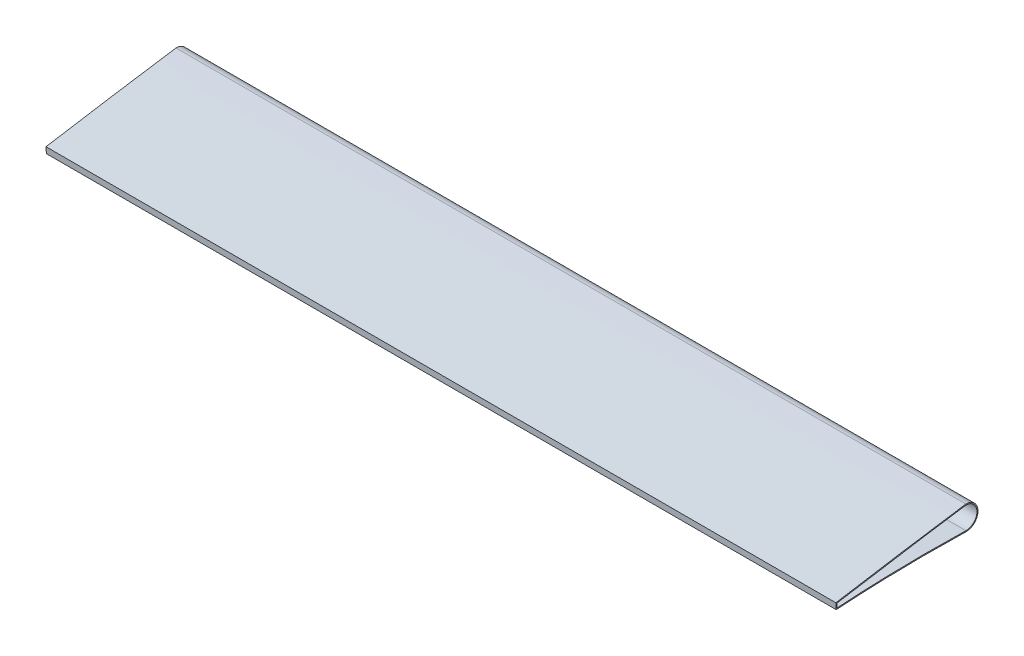
ISO-10303-21;
HEADER;
FILE_DESCRIPTION(('STEP AP214'),'2;1');
FILE_NAME('part.step','',(''),(''),'','','');
FILE_SCHEMA(('AUTOMOTIVE_DESIGN { 1 0 10303 214 1 1 1 1 }'));
ENDSEC;
DATA;
#1=APPLICATION_CONTEXT('core data for automotive mechanical design processes');
#2=APPLICATION_PROTOCOL_DEFINITION('international standard','automotive_design',2000,#1);
#3=PRODUCT_CONTEXT('',#1,'mechanical');
#4=PRODUCT('Part','Part','',(#3));
#5=PRODUCT_RELATED_PRODUCT_CATEGORY('part','',(#4));
#6=PRODUCT_DEFINITION_FORMATION('','',#4);
#7=PRODUCT_DEFINITION_CONTEXT('part definition',#1,'design');
#8=PRODUCT_DEFINITION('design','',#6,#7);
#9=PRODUCT_DEFINITION_SHAPE('','',#8);
#10=(LENGTH_UNIT() NAMED_UNIT(*) SI_UNIT(.MILLI.,.METRE.));
#11=(NAMED_UNIT(*) PLANE_ANGLE_UNIT() SI_UNIT($,.RADIAN.));
#12=(NAMED_UNIT(*) SI_UNIT($,.STERADIAN.) SOLID_ANGLE_UNIT());
#13=UNCERTAINTY_MEASURE_WITH_UNIT(LENGTH_MEASURE(1.E-05),#10,'distance_accuracy_value','');
#14=(GEOMETRIC_REPRESENTATION_CONTEXT(3) GLOBAL_UNCERTAINTY_ASSIGNED_CONTEXT((#13)) GLOBAL_UNIT_ASSIGNED_CONTEXT((#10,
#11,#12)) REPRESENTATION_CONTEXT('',''));
#15=CARTESIAN_POINT('',(0.,0.,0.));
#16=DIRECTION('',(0.,0.,1.));
#17=DIRECTION('',(1.,0.,0.));
#18=AXIS2_PLACEMENT_3D('',#15,#16,#17);
#19=CARTESIAN_POINT('',(-245.,1.54811807563614,218.484170893473));
#20=DIRECTION('',(-1.,0.,0.));
#21=DIRECTION('',(0.,0.,1.));
#22=AXIS2_PLACEMENT_3D('',#19,#20,#21);
#23=PLANE('',#22);
#24=CARTESIAN_POINT('',(-245.,1.47565816003931,200.003953165107));
#25=CARTESIAN_POINT('',(-245.,1.5550062381094,203.082868041281));
#26=CARTESIAN_POINT('',(-245.,1.65294043801315,209.239827336821));
#27=CARTESIAN_POINT('',(-245.,1.58432130369397,218.492401608303));
#28=CARTESIAN_POINT('',(-245.,1.34612255147214,226.16172659372));
#29=CARTESIAN_POINT('',(-245.,1.03963471401543,232.348041607291));
#30=CARTESIAN_POINT('',(-245.,0.850980742380833,235.412171702867));
#31=CARTESIAN_POINT('',(-245.,0.750945052306502,236.947227100444));
#32=B_SPLINE_CURVE_WITH_KNOTS('',3,(#24,#25,#26,#27,#28,#29,#30,#31),.UNSPECIFIED.,.F.,.F.,(4,1,
1,1,1,4),(0.900150223832694,0.918378482775061,0.936606741717428,0.954835000659795,
0.963949130130978,0.973063259602162),.UNSPECIFIED.);
#33=CARTESIAN_POINT('',(-245.,1.4756581600393,200.003953165107));
#34=VERTEX_POINT('',#33);
#35=CARTESIAN_POINT('',(-245.,0.750945052306502,236.947227100444));
#36=VERTEX_POINT('',#35);
#37=EDGE_CURVE('E162',#34,#36,#32,.T.);
#38=ORIENTED_EDGE('',*,*,#37,.T.);
#39=DIRECTION('',(0.,0.998451108459366,0.0556361754280817));
#40=VECTOR('',#39,1.);
#41=CARTESIAN_POINT('',(-245.,0.750945052306502,236.947227100444));
#42=LINE('',#41,#40);
#43=CARTESIAN_POINT('',(-245.,2.51874319409193,237.045733203251));
#44=VERTEX_POINT('',#43);
#45=EDGE_CURVE('E168',#36,#44,#42,.T.);
#46=ORIENTED_EDGE('',*,*,#45,.T.);
#47=CARTESIAN_POINT('',(-245.,2.51874319409193,237.045733203251));
#48=CARTESIAN_POINT('',(-245.,3.04586863369897,233.96235181676));
#49=CARTESIAN_POINT('',(-245.,3.78856871338308,229.318057473885));
#50=CARTESIAN_POINT('',(-245.,4.74545641484109,223.164972389579));
#51=CARTESIAN_POINT('',(-245.,5.78379225791457,217.006036982189));
#52=CARTESIAN_POINT('',(-245.,6.99444308437882,209.288425537747));
#53=CARTESIAN_POINT('',(-245.,7.9078668041143,203.112011401083));
#54=CARTESIAN_POINT('',(-245.,8.35923310204181,200.022291431742));
#55=B_SPLINE_CURVE_WITH_KNOTS('',3,(#47,#48,#49,#50,#51,#52,#53,#54),.UNSPECIFIED.,.F.,.F.,(4,1,
1,1,1,4),(1.024875484438,1.04333956239571,1.05257160137456,1.06180364035342,1.08026771831113,
1.09873179626884),.UNSPECIFIED.);
#56=CARTESIAN_POINT('',(-245.,8.35923310204181,200.022291431742));
#57=VERTEX_POINT('',#56);
#58=EDGE_CURVE('E174',#44,#57,#55,.T.);
#59=ORIENTED_EDGE('',*,*,#58,.T.);
#60=CARTESIAN_POINT('',(-245.,4.91748058964992,200.));
#61=DIRECTION('',(-1.,0.,0.));
#62=DIRECTION('',(0.,0.,1.));
#63=AXIS2_PLACEMENT_3D('',#60,#61,#62);
#64=CIRCLE('',#63,3.44182469984819);
#65=EDGE_CURVE('E179',#57,#34,#64,.T.);
#66=ORIENTED_EDGE('',*,*,#65,.T.);
#67=EDGE_LOOP('',(#38,#46,#59,#66));
#68=FACE_BOUND('',#67,.T.);
#69=DIRECTION('',(0.,0.998451108459367,0.0556361754280593));
#70=VECTOR('',#69,1.);
#71=CARTESIAN_POINT('',(-245.,1.07000337478338,236.664540434259));
#72=LINE('',#71,#70);
#73=CARTESIAN_POINT('',(-245.,1.07000337478338,236.664540434259));
#74=VERTEX_POINT('',#73);
#75=CARTESIAN_POINT('',(-245.,2.26814470502278,236.731303844778));
#76=VERTEX_POINT('',#75);
#77=EDGE_CURVE('E108',#74,#76,#72,.T.);
#78=ORIENTED_EDGE('',*,*,#77,.F.);
#79=CARTESIAN_POINT('',(-245.,1.77565588982335,200.));
#80=CARTESIAN_POINT('',(-245.,1.80193007716887,201.019221484981));
#81=CARTESIAN_POINT('',(-245.,1.82483857387848,202.038532259108));
#82=CARTESIAN_POINT('',(-245.,1.86358383502489,204.076997742996));
#83=CARTESIAN_POINT('',(-245.,1.87942260932456,205.096152414666));
#84=CARTESIAN_POINT('',(-245.,1.90370051567506,207.134308539318));
#85=CARTESIAN_POINT('',(-245.,1.91214140703693,208.153309971078));
#86=CARTESIAN_POINT('',(-245.,1.92128464988394,210.191160710905));
#87=CARTESIAN_POINT('',(-245.,1.92198842628703,211.210010012427));
#88=CARTESIAN_POINT('',(-245.,1.91537925536241,213.247556441768));
#89=CARTESIAN_POINT('',(-245.,1.90806730305986,214.26625357278));
#90=CARTESIAN_POINT('',(-245.,1.88547227464753,216.303495388701));
#91=CARTESIAN_POINT('',(-245.,1.87018969851098,217.322040079165));
#92=CARTESIAN_POINT('',(-245.,1.83164752288026,219.358991314676));
#93=CARTESIAN_POINT('',(-245.,1.80838782316651,220.377397857827));
#94=CARTESIAN_POINT('',(-245.,1.75388238657816,222.414055884294));
#95=CARTESIAN_POINT('',(-245.,1.72263619238608,223.432307355388));
#96=CARTESIAN_POINT('',(-245.,1.65199617014503,225.4686487178));
#97=CARTESIAN_POINT('',(-245.,1.61260137607331,226.486738575624));
#98=CARTESIAN_POINT('',(-245.,1.52552785943149,228.522752051414));
#99=CARTESIAN_POINT('',(-245.,1.47784762258254,229.540675604888));
#100=CARTESIAN_POINT('',(-245.,1.4001478009914,231.067368719544));
#101=CARTESIAN_POINT('',(-245.,1.37321423596705,231.576297320398));
#102=CARTESIAN_POINT('',(-245.,1.31744402530208,232.594050824192));
#103=CARTESIAN_POINT('',(-245.,1.28860737799694,233.102875727041));
#104=CARTESIAN_POINT('',(-245.,1.22912827879368,234.120569378009));
#105=CARTESIAN_POINT('',(-245.,1.19848530015638,234.629438095277));
#106=CARTESIAN_POINT('',(-245.,1.1354970892692,235.647068904937));
#107=CARTESIAN_POINT('',(-245.,1.10315186139889,236.155830997602));
#108=CARTESIAN_POINT('',(-245.,1.07000337478338,236.664540434259));
#109=B_SPLINE_CURVE_WITH_KNOTS('',3,(#79,#80,#81,#82,#83,#84,#85,#86,#87,#88,#89,#90,#91,#92,
#93,#94,#95,#96,#97,#98,#99,#100,#101,#102,#103,#104,#105,#106,#107,#108),.UNSPECIFIED.,.F.,.F.,
(4,2,2,2,2,2,2,2,2,2,2,2,2,2,4),(0.,3.05867843013735,6.11648674890835,9.17356768433635,
12.2300855982153,15.2862241369955,18.3421709964681,21.3981562503518,24.4543165333021,
27.5108393342584,30.5679213455393,32.0968405884251,33.6257611685829,35.1551298199108,
36.6844945366367),.UNSPECIFIED.);
#110=CARTESIAN_POINT('',(-245.,1.77565588982335,200.));
#111=VERTEX_POINT('',#110);
#112=EDGE_CURVE('E127',#111,#74,#109,.T.);
#113=ORIENTED_EDGE('',*,*,#112,.F.);
#114=CARTESIAN_POINT('',(-245.,4.91748058964992,200.));
#115=DIRECTION('',(-1.,0.,0.));
#116=DIRECTION('',(0.,0.,1.));
#117=AXIS2_PLACEMENT_3D('',#114,#115,#116);
#118=CIRCLE('',#117,3.14182469984818);
#119=CARTESIAN_POINT('',(-245.,8.0593052894981,200.));
#120=VERTEX_POINT('',#119);
#121=EDGE_CURVE('E125',#120,#111,#118,.T.);
#122=ORIENTED_EDGE('',*,*,#121,.F.);
#123=CARTESIAN_POINT('',(-245.,2.26814470502278,236.731303844778));
#124=CARTESIAN_POINT('',(-245.,2.33083056445869,236.364621328988));
#125=CARTESIAN_POINT('',(-245.,2.39325546410141,235.997893955187));
#126=CARTESIAN_POINT('',(-245.,2.51745943686344,235.264336572296));
#127=CARTESIAN_POINT('',(-245.,2.579238521393,234.897506565138));
#128=CARTESIAN_POINT('',(-245.,2.70202855962353,234.16372175285));
#129=CARTESIAN_POINT('',(-245.,2.76303952113619,233.796766949029));
#130=CARTESIAN_POINT('',(-245.,2.88418324501267,233.062703808016));
#131=CARTESIAN_POINT('',(-245.,2.94431598763467,232.695595467563));
#132=CARTESIAN_POINT('',(-245.,3.06352746915682,231.961206970734));
#133=CARTESIAN_POINT('',(-245.,3.12260620621509,231.593926814059));
#134=CARTESIAN_POINT('',(-245.,3.23981871751814,230.859213897666));
#135=CARTESIAN_POINT('',(-245.,3.29795248656066,230.491781137121));
#136=CARTESIAN_POINT('',(-245.,3.44252043662053,229.573085609124));
#137=CARTESIAN_POINT('',(-245.,3.52857191345396,229.021762753734));
#138=CARTESIAN_POINT('',(-245.,3.70028746568279,227.919055978052));
#139=CARTESIAN_POINT('',(-245.,3.78595154031523,227.36767205764));
#140=CARTESIAN_POINT('',(-245.,3.95792020952995,226.265006783856));
#141=CARTESIAN_POINT('',(-245.,4.04422480041138,225.713725429909));
#142=CARTESIAN_POINT('',(-245.,4.17491380471411,224.886999756387));
#143=CARTESIAN_POINT('',(-245.,4.2186820109389,224.611458177864));
#144=CARTESIAN_POINT('',(-245.,4.30677577184764,224.060464142334));
#145=CARTESIAN_POINT('',(-245.,4.35110132644824,223.785011685314));
#146=CARTESIAN_POINT('',(-245.,4.44024658627286,223.234187830318));
#147=CARTESIAN_POINT('',(-245.,4.4850662897309,222.958816432055));
#148=CARTESIAN_POINT('',(-245.,4.57508113375219,222.408134967495));
#149=CARTESIAN_POINT('',(-245.,4.62027627442476,222.132824901216));
#150=CARTESIAN_POINT('',(-245.,4.75626859065517,221.306957330376));
#151=CARTESIAN_POINT('',(-245.,4.8474719530371,220.756466803068));
#152=CARTESIAN_POINT('',(-245.,5.03010415130944,219.655521062394));
#153=CARTESIAN_POINT('',(-245.,5.12153298809882,219.105065849177));
#154=CARTESIAN_POINT('',(-245.,5.25820381698331,218.279305274775));
#155=CARTESIAN_POINT('',(-245.,5.30368197529259,218.004039076489));
#156=CARTESIAN_POINT('',(-245.,5.39437539160673,217.453463369615));
#157=CARTESIAN_POINT('',(-245.,5.43959064961879,217.178153861027));
#158=CARTESIAN_POINT('',(-245.,5.54465397033374,216.535697799435));
#159=CARTESIAN_POINT('',(-245.,5.60435597561208,216.168527314978));
#160=CARTESIAN_POINT('',(-245.,5.72287441537469,215.434043427967));
#161=CARTESIAN_POINT('',(-245.,5.78169084987837,215.066730025415));
#162=CARTESIAN_POINT('',(-245.,5.89854810843837,214.331979336451));
#163=CARTESIAN_POINT('',(-245.,5.95658893120465,213.964542049833));
#164=CARTESIAN_POINT('',(-245.,6.07197701444798,213.229558559178));
#165=CARTESIAN_POINT('',(-245.,6.12932427475883,212.862012355114));
#166=CARTESIAN_POINT('',(-245.,6.30045991587274,211.759231684175));
#167=CARTESIAN_POINT('',(-245.,6.41334193403545,211.023856563887));
#168=CARTESIAN_POINT('',(-245.,6.63739652165218,209.552850643797));
#169=CARTESIAN_POINT('',(-245.,6.7485691000256,208.817219845349));
#170=CARTESIAN_POINT('',(-245.,6.91457011414373,207.71366042941));
#171=CARTESIAN_POINT('',(-245.,6.96977743569107,207.345788695637));
#172=CARTESIAN_POINT('',(-245.,7.08004043878003,206.610022508207));
#173=CARTESIAN_POINT('',(-245.,7.13509612032222,206.242128054549));
#174=CARTESIAN_POINT('',(-245.,7.30004991220947,205.138413047346));
#175=CARTESIAN_POINT('',(-245.,7.40973480940987,204.402560584033));
#176=CARTESIAN_POINT('',(-245.,7.56435865989229,203.361141463167));
#177=CARTESIAN_POINT('',(-245.,7.60964567529629,203.055626478501));
#178=CARTESIAN_POINT('',(-245.,7.70005903343056,202.444572929805));
#179=CARTESIAN_POINT('',(-245.,7.74518537626278,202.13903436579));
#180=CARTESIAN_POINT('',(-245.,7.83525965441882,201.527930224292));
#181=CARTESIAN_POINT('',(-245.,7.8802075893354,201.22236464675));
#182=CARTESIAN_POINT('',(-245.,7.96990764194205,200.611204574069));
#183=CARTESIAN_POINT('',(-245.,8.0146597595196,200.305610078915));
#184=CARTESIAN_POINT('',(-245.,8.05930528950531,200.));
#185=B_SPLINE_CURVE_WITH_KNOTS('',3,(#123,#124,#125,#126,#127,#128,#129,#130,#131,#132,#133,
#134,#135,#136,#137,#138,#139,#140,#141,#142,#143,#144,#145,#146,#147,#148,#149,#150,#151,#152,
#153,#154,#155,#156,#157,#158,#159,#160,#161,#162,#163,#164,#165,#166,#167,#168,#169,#170,#171,
#172,#173,#174,#175,#176,#177,#178,#179,#180,#181,#182,#183,#184),.UNSPECIFIED.,.F.,.F.,(4,2,2,
2,2,2,2,2,2,2,2,2,2,2,2,2,2,2,2,2,2,2,2,2,2,2,2,2,2,2,4),(0.,1.11600666365696,2.23199357627061,
3.34796913030056,4.46396973229304,5.57997228432389,6.69598097811679,8.36997411367353,
10.0439705445504,11.7179573107467,12.5549451041878,13.3919327724456,14.2289174504794,
15.0659023722487,16.7398854349732,18.4138751827348,19.250868319964,20.0878614342137,
21.2038382995708,22.3198151404693,23.4357938372772,24.5517728014941,26.7837349985788,
29.0156855459446,30.1316591539291,31.247632757752,33.4795791659149,34.4061388296661,
35.3326979053394,36.2592590947285,37.1858208164991),.UNSPECIFIED.);
#186=EDGE_CURVE('E209',#76,#120,#185,.T.);
#187=ORIENTED_EDGE('',*,*,#186,.F.);
#188=EDGE_LOOP('',(#78,#113,#122,#187));
#189=FACE_BOUND('',#188,.T.);
#190=ADVANCED_FACE('F34',(#68,#189),#23,.T.);
#191=CARTESIAN_POINT('',(-20.,1.54811807563614,218.484170893473));
#192=DIRECTION('',(-1.,0.,0.));
#193=DIRECTION('',(0.,0.,1.));
#194=AXIS2_PLACEMENT_3D('',#191,#192,#193);
#195=PLANE('',#194);
#196=CARTESIAN_POINT('',(-20.,1.47565816003931,200.003953165107));
#197=CARTESIAN_POINT('',(-20.,1.5550062381094,203.082868041281));
#198=CARTESIAN_POINT('',(-20.,1.65294043801315,209.239827336821));
#199=CARTESIAN_POINT('',(-20.,1.58432130369397,218.492401608303));
#200=CARTESIAN_POINT('',(-20.,1.34612255147214,226.16172659372));
#201=CARTESIAN_POINT('',(-20.,1.03963471401543,232.348041607291));
#202=CARTESIAN_POINT('',(-20.,0.850980742380833,235.412171702867));
#203=CARTESIAN_POINT('',(-20.,0.750945052306502,236.947227100444));
#204=B_SPLINE_CURVE_WITH_KNOTS('',3,(#196,#197,#198,#199,#200,#201,#202,#203),.UNSPECIFIED.,.F.,
.F.,(4,1,1,1,1,4),(0.900150223832694,0.918378482775061,0.936606741717428,0.954835000659795,
0.963949130130978,0.973063259602162),.UNSPECIFIED.);
#205=CARTESIAN_POINT('',(-20.,1.4756581600393,200.003953165107));
#206=VERTEX_POINT('',#205);
#207=CARTESIAN_POINT('',(-20.,0.750945052306502,236.947227100444));
#208=VERTEX_POINT('',#207);
#209=EDGE_CURVE('E161',#206,#208,#204,.T.);
#210=ORIENTED_EDGE('',*,*,#209,.F.);
#211=CARTESIAN_POINT('',(-20.,4.91748058964992,200.));
#212=DIRECTION('',(-1.,0.,0.));
#213=DIRECTION('',(0.,0.,1.));
#214=AXIS2_PLACEMENT_3D('',#211,#212,#213);
#215=CIRCLE('',#214,3.44182469984819);
#216=CARTESIAN_POINT('',(-20.,8.35923310204181,200.022291431742));
#217=VERTEX_POINT('',#216);
#218=EDGE_CURVE('E169',#217,#206,#215,.T.);
#219=ORIENTED_EDGE('',*,*,#218,.F.);
#220=CARTESIAN_POINT('',(-20.,2.51874319409193,237.045733203251));
#221=CARTESIAN_POINT('',(-20.,3.04586863369897,233.96235181676));
#222=CARTESIAN_POINT('',(-20.,3.78856871338308,229.318057473885));
#223=CARTESIAN_POINT('',(-20.,4.74545641484109,223.164972389579));
#224=CARTESIAN_POINT('',(-20.,5.78379225791457,217.006036982189));
#225=CARTESIAN_POINT('',(-20.,6.99444308437882,209.288425537747));
#226=CARTESIAN_POINT('',(-20.,7.9078668041143,203.112011401083));
#227=CARTESIAN_POINT('',(-20.,8.35923310204181,200.022291431742));
#228=B_SPLINE_CURVE_WITH_KNOTS('',3,(#220,#221,#222,#223,#224,#225,#226,#227),.UNSPECIFIED.,.F.,
.F.,(4,1,1,1,1,4),(1.024875484438,1.04333956239571,1.05257160137456,1.06180364035342,
1.08026771831113,1.09873179626884),.UNSPECIFIED.);
#229=CARTESIAN_POINT('',(-20.,2.51874319409193,237.045733203251));
#230=VERTEX_POINT('',#229);
#231=EDGE_CURVE('E287',#230,#217,#228,.T.);
#232=ORIENTED_EDGE('',*,*,#231,.F.);
#233=DIRECTION('',(0.,0.998451108459366,0.0556361754280817));
#234=VECTOR('',#233,1.);
#235=CARTESIAN_POINT('',(-20.,0.750945052306502,236.947227100444));
#236=LINE('',#235,#234);
#237=EDGE_CURVE('E291',#208,#230,#236,.T.);
#238=ORIENTED_EDGE('',*,*,#237,.F.);
#239=EDGE_LOOP('',(#210,#219,#232,#238));
#240=FACE_BOUND('',#239,.T.);
#241=CARTESIAN_POINT('',(-20.,1.77565588982335,200.));
#242=CARTESIAN_POINT('',(-20.,1.80193007716887,201.019221484981));
#243=CARTESIAN_POINT('',(-20.,1.82483857387848,202.038532259108));
#244=CARTESIAN_POINT('',(-20.,1.86358383502489,204.076997742996));
#245=CARTESIAN_POINT('',(-20.,1.87942260932456,205.096152414666));
#246=CARTESIAN_POINT('',(-20.,1.90370051567506,207.134308539318));
#247=CARTESIAN_POINT('',(-20.,1.91214140703693,208.153309971078));
#248=CARTESIAN_POINT('',(-20.,1.92128464988394,210.191160710905));
#249=CARTESIAN_POINT('',(-20.,1.92198842628703,211.210010012427));
#250=CARTESIAN_POINT('',(-20.,1.91537925536241,213.247556441768));
#251=CARTESIAN_POINT('',(-20.,1.90806730305986,214.26625357278));
#252=CARTESIAN_POINT('',(-20.,1.88547227464753,216.303495388701));
#253=CARTESIAN_POINT('',(-20.,1.87018969851098,217.322040079165));
#254=CARTESIAN_POINT('',(-20.,1.83164752288026,219.358991314676));
#255=CARTESIAN_POINT('',(-20.,1.80838782316651,220.377397857827));
#256=CARTESIAN_POINT('',(-20.,1.75388238657816,222.414055884294));
#257=CARTESIAN_POINT('',(-20.,1.72263619238608,223.432307355388));
#258=CARTESIAN_POINT('',(-20.,1.65199617014503,225.4686487178));
#259=CARTESIAN_POINT('',(-20.,1.61260137607331,226.486738575624));
#260=CARTESIAN_POINT('',(-20.,1.52552785943149,228.522752051414));
#261=CARTESIAN_POINT('',(-20.,1.47784762258254,229.540675604888));
#262=CARTESIAN_POINT('',(-20.,1.4001478009914,231.067368719544));
#263=CARTESIAN_POINT('',(-20.,1.37321423596705,231.576297320398));
#264=CARTESIAN_POINT('',(-20.,1.31744402530208,232.594050824192));
#265=CARTESIAN_POINT('',(-20.,1.28860737799694,233.102875727041));
#266=CARTESIAN_POINT('',(-20.,1.22912827879368,234.120569378009));
#267=CARTESIAN_POINT('',(-20.,1.19848530015638,234.629438095277));
#268=CARTESIAN_POINT('',(-20.,1.1354970892692,235.647068904937));
#269=CARTESIAN_POINT('',(-20.,1.10315186139889,236.155830997602));
#270=CARTESIAN_POINT('',(-20.,1.07000337478338,236.664540434259));
#271=B_SPLINE_CURVE_WITH_KNOTS('',3,(#241,#242,#243,#244,#245,#246,#247,#248,#249,#250,#251,
#252,#253,#254,#255,#256,#257,#258,#259,#260,#261,#262,#263,#264,#265,#266,#267,#268,#269,#270),
.UNSPECIFIED.,.F.,.F.,(4,2,2,2,2,2,2,2,2,2,2,2,2,2,4),(0.,3.05867843013735,6.11648674890835,
9.17356768433635,12.2300855982153,15.2862241369955,18.3421709964681,21.3981562503518,
24.4543165333021,27.5108393342584,30.5679213455393,32.0968405884251,33.6257611685829,
35.1551298199108,36.6844945366367),.UNSPECIFIED.);
#272=CARTESIAN_POINT('',(-20.,1.77565588980173,200.));
#273=VERTEX_POINT('',#272);
#274=CARTESIAN_POINT('',(-20.,1.07000337478338,236.664540434259));
#275=VERTEX_POINT('',#274);
#276=EDGE_CURVE('E58',#273,#275,#271,.T.);
#277=ORIENTED_EDGE('',*,*,#276,.T.);
#278=DIRECTION('',(0.,0.998451108459367,0.0556361754280593));
#279=VECTOR('',#278,1.);
#280=CARTESIAN_POINT('',(-20.,1.07000337478338,236.664540434259));
#281=LINE('',#280,#279);
#282=CARTESIAN_POINT('',(-20.,2.26814470502279,236.731303844778));
#283=VERTEX_POINT('',#282);
#284=EDGE_CURVE('E106',#275,#283,#281,.T.);
#285=ORIENTED_EDGE('',*,*,#284,.T.);
#286=CARTESIAN_POINT('',(-20.,2.26814470502279,236.731303844778));
#287=CARTESIAN_POINT('',(-20.,2.33083056445869,236.364621328988));
#288=CARTESIAN_POINT('',(-20.,2.39325546410141,235.997893955186));
#289=CARTESIAN_POINT('',(-20.,2.51745943686343,235.264336572296));
#290=CARTESIAN_POINT('',(-20.,2.579238521393,234.897506565137));
#291=CARTESIAN_POINT('',(-20.,2.70202855962353,234.16372175285));
#292=CARTESIAN_POINT('',(-20.,2.7630395211362,233.796766949029));
#293=CARTESIAN_POINT('',(-20.,2.88418324501268,233.062703808016));
#294=CARTESIAN_POINT('',(-20.,2.94431598763468,232.695595467563));
#295=CARTESIAN_POINT('',(-20.,3.06352746915683,231.961206970734));
#296=CARTESIAN_POINT('',(-20.,3.1226062062151,231.593926814058));
#297=CARTESIAN_POINT('',(-20.,3.23981871751814,230.859213897666));
#298=CARTESIAN_POINT('',(-20.,3.29795248656067,230.49178113712));
#299=CARTESIAN_POINT('',(-20.0000000000001,3.44252043662054,229.573085609124));
#300=CARTESIAN_POINT('',(-20.,3.52857191345398,229.021762753734));
#301=CARTESIAN_POINT('',(-20.,3.7002874656828,227.919055978052));
#302=CARTESIAN_POINT('',(-20.,3.78595154031524,227.36767205764));
#303=CARTESIAN_POINT('',(-20.,3.95792020952995,226.265006783856));
#304=CARTESIAN_POINT('',(-20.,4.04422480041139,225.713725429909));
#305=CARTESIAN_POINT('',(-20.,4.17491380471413,224.886999756387));
#306=CARTESIAN_POINT('',(-20.,4.21868201093891,224.611458177864));
#307=CARTESIAN_POINT('',(-20.,4.30677577184765,224.060464142334));
#308=CARTESIAN_POINT('',(-20.,4.35110132644826,223.785011685314));
#309=CARTESIAN_POINT('',(-20.,4.44024658627287,223.234187830318));
#310=CARTESIAN_POINT('',(-20.,4.48506628973091,222.958816432055));
#311=CARTESIAN_POINT('',(-20.,4.5750811337522,222.408134967494));
#312=CARTESIAN_POINT('',(-20.,4.62027627442478,222.132824901215));
#313=CARTESIAN_POINT('',(-20.,4.75626859065519,221.306957330376));
#314=CARTESIAN_POINT('',(-20.,4.84747195303712,220.756466803068));
#315=CARTESIAN_POINT('',(-20.,5.03010415130945,219.655521062394));
#316=CARTESIAN_POINT('',(-20.,5.12153298809883,219.105065849177));
#317=CARTESIAN_POINT('',(-20.,5.25820381698332,218.279305274775));
#318=CARTESIAN_POINT('',(-20.,5.3036819752926,218.004039076489));
#319=CARTESIAN_POINT('',(-20.,5.39437539160674,217.453463369615));
#320=CARTESIAN_POINT('',(-20.,5.43959064961881,217.178153861027));
#321=CARTESIAN_POINT('',(-20.,5.54465397033375,216.535697799435));
#322=CARTESIAN_POINT('',(-20.,5.60435597561208,216.168527314978));
#323=CARTESIAN_POINT('',(-20.,5.72287441537468,215.434043427967));
#324=CARTESIAN_POINT('',(-20.,5.78169084987837,215.066730025415));
#325=CARTESIAN_POINT('',(-20.,5.89854810843838,214.331979336451));
#326=CARTESIAN_POINT('',(-20.,5.95658893120467,213.964542049833));
#327=CARTESIAN_POINT('',(-20.,6.071977014448,213.229558559178));
#328=CARTESIAN_POINT('',(-20.,6.12932427475885,212.862012355114));
#329=CARTESIAN_POINT('',(-20.,6.30045991587276,211.759231684175));
#330=CARTESIAN_POINT('',(-20.,6.41334193403546,211.023856563887));
#331=CARTESIAN_POINT('',(-20.,6.6373965216522,209.552850643797));
#332=CARTESIAN_POINT('',(-20.,6.74856910002562,208.817219845349));
#333=CARTESIAN_POINT('',(-20.,6.91457011414374,207.71366042941));
#334=CARTESIAN_POINT('',(-20.,6.96977743569108,207.345788695637));
#335=CARTESIAN_POINT('',(-20.,7.08004043878004,206.610022508207));
#336=CARTESIAN_POINT('',(-20.,7.13509612032223,206.242128054549));
#337=CARTESIAN_POINT('',(-20.,7.30004991220951,205.138413047346));
#338=CARTESIAN_POINT('',(-20.,7.40973480940989,204.402560584033));
#339=CARTESIAN_POINT('',(-20.,7.5643586598923,203.361141463166));
#340=CARTESIAN_POINT('',(-20.,7.6096456752963,203.055626478501));
#341=CARTESIAN_POINT('',(-20.,7.70005903343057,202.444572929805));
#342=CARTESIAN_POINT('',(-20.,7.7451853762628,202.13903436579));
#343=CARTESIAN_POINT('',(-20.,7.83525965441884,201.527930224292));
#344=CARTESIAN_POINT('',(-20.,7.8802075893354,201.22236464675));
#345=CARTESIAN_POINT('',(-20.,7.96990764194204,200.611204574069));
#346=CARTESIAN_POINT('',(-20.,8.01465975951959,200.305610078915));
#347=CARTESIAN_POINT('',(-20.,8.05930528950531,200.));
#348=B_SPLINE_CURVE_WITH_KNOTS('',3,(#286,#287,#288,#289,#290,#291,#292,#293,#294,#295,#296,
#297,#298,#299,#300,#301,#302,#303,#304,#305,#306,#307,#308,#309,#310,#311,#312,#313,#314,#315,
#316,#317,#318,#319,#320,#321,#322,#323,#324,#325,#326,#327,#328,#329,#330,#331,#332,#333,#334,
#335,#336,#337,#338,#339,#340,#341,#342,#343,#344,#345,#346,#347),.UNSPECIFIED.,.F.,.F.,(4,2,2,
2,2,2,2,2,2,2,2,2,2,2,2,2,2,2,2,2,2,2,2,2,2,2,2,2,2,2,4),(0.,1.11600666365693,2.23199357627058,
3.34796913030056,4.46396973229304,5.57997228432387,6.69598097811682,8.36997411367351,
10.0439705445504,11.7179573107467,12.5549451041878,13.3919327724456,14.2289174504795,
15.0659023722487,16.7398854349732,18.4138751827348,19.250868319964,20.0878614342138,
21.2038382995708,22.3198151404693,23.4357938372773,24.5517728014942,26.7837349985789,
29.0156855459447,30.1316591539292,31.247632757752,33.4795791659149,34.4061388296661,
35.3326979053394,36.2592590947284,37.185820816499),.UNSPECIFIED.);
#349=CARTESIAN_POINT('',(-20.,8.05930528950531,200.));
#350=VERTEX_POINT('',#349);
#351=EDGE_CURVE('E114',#283,#350,#348,.T.);
#352=ORIENTED_EDGE('',*,*,#351,.T.);
#353=CARTESIAN_POINT('',(-20.,4.91748058964992,200.));
#354=DIRECTION('',(-1.,0.,0.));
#355=DIRECTION('',(0.,0.,1.));
#356=AXIS2_PLACEMENT_3D('',#353,#354,#355);
#357=CIRCLE('',#356,3.14182469984818);
#358=EDGE_CURVE('E118',#350,#273,#357,.T.);
#359=ORIENTED_EDGE('',*,*,#358,.T.);
#360=EDGE_LOOP('',(#277,#285,#352,#359));
#361=FACE_BOUND('',#360,.T.);
#362=ADVANCED_FACE('F120',(#240,#361),#195,.F.);
#363=DIRECTION('',(1.,0.,0.));
#364=VECTOR('',#363,1.);
#365=SURFACE_OF_LINEAR_EXTRUSION('',#32,#364);
#366=ORIENTED_EDGE('',*,*,#209,.T.);
#367=DIRECTION('',(1.,0.,0.));
#368=VECTOR('',#367,1.);
#369=CARTESIAN_POINT('',(-245.,0.750945052306502,236.947227100444));
#370=LINE('',#369,#368);
#371=EDGE_CURVE('E11',#36,#208,#370,.T.);
#372=ORIENTED_EDGE('',*,*,#371,.F.);
#373=ORIENTED_EDGE('',*,*,#37,.F.);
#374=DIRECTION('',(1.,0.,0.));
#375=VECTOR('',#374,1.);
#376=CARTESIAN_POINT('',(-245.,1.4756581600393,200.003953165107));
#377=LINE('',#376,#375);
#378=EDGE_CURVE('E282',#34,#206,#377,.T.);
#379=ORIENTED_EDGE('',*,*,#378,.T.);
#380=EDGE_LOOP('',(#366,#372,#373,#379));
#381=FACE_BOUND('',#380,.T.);
#382=ADVANCED_FACE('F36',(#381),#365,.F.);
#383=CARTESIAN_POINT('',(-245.,0.750945052306502,236.947227100444));
#384=DIRECTION('',(0.,0.0556361754280817,-0.998451108459365));
#385=DIRECTION('',(0.,0.998451108459366,0.0556361754280817));
#386=AXIS2_PLACEMENT_3D('',#383,#384,#385);
#387=PLANE('',#386);
#388=ORIENTED_EDGE('',*,*,#237,.T.);
#389=DIRECTION('',(1.,0.,0.));
#390=VECTOR('',#389,1.);
#391=CARTESIAN_POINT('',(-245.,2.51874319409193,237.045733203251));
#392=LINE('',#391,#390);
#393=EDGE_CURVE('E43',#44,#230,#392,.T.);
#394=ORIENTED_EDGE('',*,*,#393,.F.);
#395=ORIENTED_EDGE('',*,*,#45,.F.);
#396=ORIENTED_EDGE('',*,*,#371,.T.);
#397=EDGE_LOOP('',(#388,#394,#395,#396));
#398=FACE_BOUND('',#397,.T.);
#399=ADVANCED_FACE('F189',(#398),#387,.F.);
#400=DIRECTION('',(1.,0.,0.));
#401=VECTOR('',#400,1.);
#402=SURFACE_OF_LINEAR_EXTRUSION('',#55,#401);
#403=ORIENTED_EDGE('',*,*,#231,.T.);
#404=DIRECTION('',(1.,0.,0.));
#405=VECTOR('',#404,1.);
#406=CARTESIAN_POINT('',(-245.,8.35923310204181,200.022291431742));
#407=LINE('',#406,#405);
#408=EDGE_CURVE('E284',#57,#217,#407,.T.);
#409=ORIENTED_EDGE('',*,*,#408,.F.);
#410=ORIENTED_EDGE('',*,*,#58,.F.);
#411=ORIENTED_EDGE('',*,*,#393,.T.);
#412=EDGE_LOOP('',(#403,#409,#410,#411));
#413=FACE_BOUND('',#412,.T.);
#414=ADVANCED_FACE('F185',(#413),#402,.F.);
#415=CARTESIAN_POINT('',(-245.,4.91748058964992,200.));
#416=DIRECTION('',(1.,0.,0.));
#417=DIRECTION('',(0.,0.,-1.));
#418=AXIS2_PLACEMENT_3D('',#415,#416,#417);
#419=CYLINDRICAL_SURFACE('',#418,3.44182469984819);
#420=ORIENTED_EDGE('',*,*,#218,.T.);
#421=ORIENTED_EDGE('',*,*,#378,.F.);
#422=ORIENTED_EDGE('',*,*,#65,.F.);
#423=ORIENTED_EDGE('',*,*,#408,.T.);
#424=EDGE_LOOP('',(#420,#421,#422,#423));
#425=FACE_BOUND('',#424,.T.);
#426=ADVANCED_FACE('F188',(#425),#419,.T.);
#427=CARTESIAN_POINT('',(225.,8.05930528950531,200.));
#428=CARTESIAN_POINT('',(225.,7.73975867618285,202.187379866089));
#429=CARTESIAN_POINT('',(225.,6.94925041958615,207.505720729808));
#430=CARTESIAN_POINT('',(225.,5.73122177085008,215.560350587429));
#431=CARTESIAN_POINT('',(225.,4.29329513146071,223.977157043251));
#432=CARTESIAN_POINT('',(225.,3.18180887934278,231.363413337264));
#433=CARTESIAN_POINT('',(225.,2.09894242404895,237.746440905393));
#434=CARTESIAN_POINT('',(225.,1.24586192427853,242.622069367074));
#435=CARTESIAN_POINT('',(225.,0.552864954565253,246.644529333807));
#436=CARTESIAN_POINT('',(225.,0.246216773274338,248.328398441758));
#437=CARTESIAN_POINT('',(225.,-0.0529666919521304,250.42732845939));
#438=CARTESIAN_POINT('',(225.,0.17237566659398,248.284955516936));
#439=CARTESIAN_POINT('',(225.,0.308690023107385,246.518112420767));
#440=CARTESIAN_POINT('',(225.,0.685693601393518,242.189387344711));
#441=CARTESIAN_POINT('',(225.,1.07410153549871,236.80646126474));
#442=CARTESIAN_POINT('',(225.,1.49731724526382,229.680385952807));
#443=CARTESIAN_POINT('',(225.,1.82321860647773,221.184158699391));
#444=CARTESIAN_POINT('',(225.,1.96762610272828,211.33761820881));
#445=CARTESIAN_POINT('',(225.,1.87929616202421,204.130566759099));
#446=CARTESIAN_POINT('',(225.,1.7814329165647,200.224163886594));
#447=CARTESIAN_POINT('',(225.,1.77565588982335,200.));
#448=B_SPLINE_CURVE_WITH_KNOTS('',3,(#427,#428,#429,#430,#431,#432,#433,#434,#435,#436,#437,
#438,#439,#440,#441,#442,#443,#444,#445,#446,#447),.UNSPECIFIED.,.F.,.F.,(4,1,1,1,1,1,1,1,1,1,1,
1,1,1,1,1,1,1,4),(0.900157669806231,0.913230871058069,0.931955467148994,0.94834206907442,
0.963693004275676,0.976235918239566,0.986320058750392,0.993788799349345,0.998424034933867,1.,
1.00158888881615,1.00632921783556,1.01420245648974,1.02517280775306,1.03917348332677,
1.05606063117592,1.07557892384879,1.09736360662969,1.09868981187535),.UNSPECIFIED.);
#449=DIRECTION('',(-1.,0.,0.));
#450=VECTOR('',#449,1.);
#451=SURFACE_OF_LINEAR_EXTRUSION('',#448,#450);
#452=ORIENTED_EDGE('',*,*,#276,.F.);
#453=DIRECTION('',(-1.,0.,0.));
#454=VECTOR('',#453,1.);
#455=CARTESIAN_POINT('',(-132.5,1.77565588982335,200.));
#456=LINE('',#455,#454);
#457=EDGE_CURVE('E154',#111,#273,#456,.F.);
#458=ORIENTED_EDGE('',*,*,#457,.F.);
#459=ORIENTED_EDGE('',*,*,#112,.T.);
#460=DIRECTION('',(-1.,0.,0.));
#461=VECTOR('',#460,1.);
#462=CARTESIAN_POINT('',(-132.5,1.07000337478338,236.664540434259));
#463=LINE('',#462,#461);
#464=EDGE_CURVE('E111',#74,#275,#463,.F.);
#465=ORIENTED_EDGE('',*,*,#464,.T.);
#466=EDGE_LOOP('',(#452,#458,#459,#465));
#467=FACE_BOUND('',#466,.T.);
#468=ADVANCED_FACE('F214',(#467),#451,.T.);
#469=CARTESIAN_POINT('',(-245.,1.07000337478338,236.664540434259));
#470=DIRECTION('',(0.,0.0556361754280593,-0.998451108459367));
#471=DIRECTION('',(0.,0.998451108459367,0.0556361754280593));
#472=AXIS2_PLACEMENT_3D('',#469,#470,#471);
#473=PLANE('',#472);
#474=ORIENTED_EDGE('',*,*,#284,.F.);
#475=ORIENTED_EDGE('',*,*,#464,.F.);
#476=ORIENTED_EDGE('',*,*,#77,.T.);
#477=DIRECTION('',(-1.,0.,0.));
#478=VECTOR('',#477,1.);
#479=CARTESIAN_POINT('',(-132.5,2.26814470502278,236.731303844778));
#480=LINE('',#479,#478);
#481=EDGE_CURVE('E101',#76,#283,#480,.F.);
#482=ORIENTED_EDGE('',*,*,#481,.T.);
#483=EDGE_LOOP('',(#474,#475,#476,#482));
#484=FACE_BOUND('',#483,.T.);
#485=ADVANCED_FACE('F103',(#484),#473,.T.);
#486=ORIENTED_EDGE('',*,*,#351,.F.);
#487=ORIENTED_EDGE('',*,*,#481,.F.);
#488=ORIENTED_EDGE('',*,*,#186,.T.);
#489=DIRECTION('',(-1.,0.,0.));
#490=VECTOR('',#489,1.);
#491=CARTESIAN_POINT('',(-132.5,8.05930528951251,200.));
#492=LINE('',#491,#490);
#493=EDGE_CURVE('E50',#120,#350,#492,.F.);
#494=ORIENTED_EDGE('',*,*,#493,.T.);
#495=EDGE_LOOP('',(#486,#487,#488,#494));
#496=FACE_BOUND('',#495,.T.);
#497=ADVANCED_FACE('F115',(#496),#451,.T.);
#498=CARTESIAN_POINT('',(-245.,4.91748058964992,200.));
#499=DIRECTION('',(1.,0.,0.));
#500=DIRECTION('',(0.,0.,-1.));
#501=AXIS2_PLACEMENT_3D('',#498,#499,#500);
#502=CYLINDRICAL_SURFACE('',#501,3.14182469984818);
#503=ORIENTED_EDGE('',*,*,#358,.F.);
#504=ORIENTED_EDGE('',*,*,#493,.F.);
#505=ORIENTED_EDGE('',*,*,#121,.T.);
#506=ORIENTED_EDGE('',*,*,#457,.T.);
#507=EDGE_LOOP('',(#503,#504,#505,#506));
#508=FACE_BOUND('',#507,.T.);
#509=ADVANCED_FACE('F145',(#508),#502,.F.);
#510=CLOSED_SHELL('',(#190,#362,#382,#399,#414,#426,#468,#485,#497,#509));
#511=MANIFOLD_SOLID_BREP('B2',#510);
#512=ADVANCED_BREP_SHAPE_REPRESENTATION('',(#18,#511),#14);
#513=SHAPE_DEFINITION_REPRESENTATION(#9,#512);
ENDSEC;
END-ISO-10303-21;
